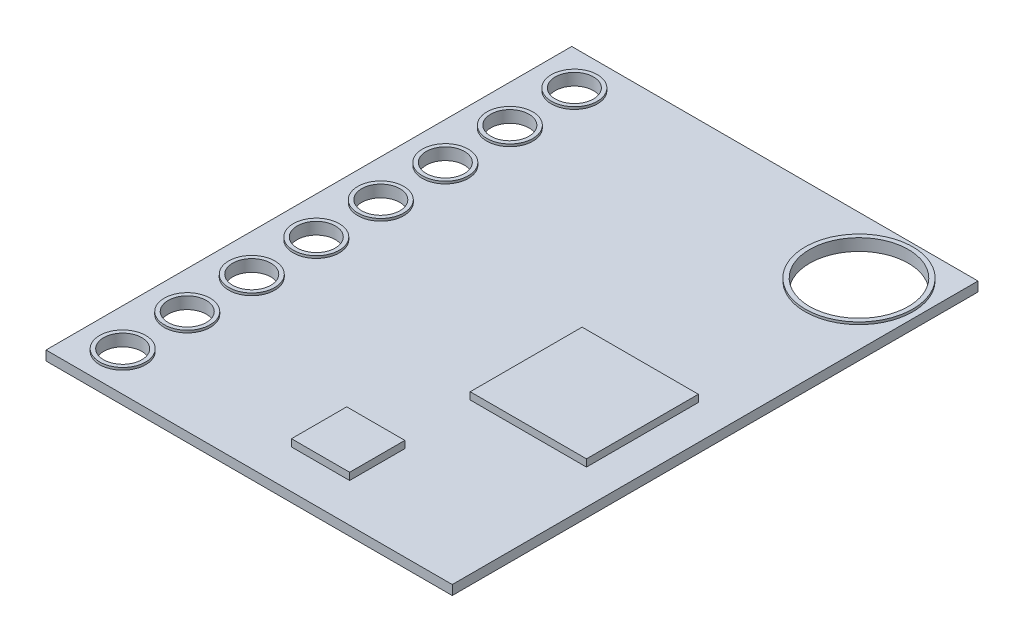
ISO-10303-21;
HEADER;
FILE_DESCRIPTION(('STEP AP214'),'2;1');
FILE_NAME('part.step','',(''),(''),'','','');
FILE_SCHEMA(('AUTOMOTIVE_DESIGN { 1 0 10303 214 1 1 1 1 }'));
ENDSEC;
DATA;
#1=APPLICATION_CONTEXT('core data for automotive mechanical design processes');
#2=APPLICATION_PROTOCOL_DEFINITION('international standard','automotive_design',2000,#1);
#3=PRODUCT_CONTEXT('',#1,'mechanical');
#4=PRODUCT('Part','Part','',(#3));
#5=PRODUCT_RELATED_PRODUCT_CATEGORY('part','',(#4));
#6=PRODUCT_DEFINITION_FORMATION('','',#4);
#7=PRODUCT_DEFINITION_CONTEXT('part definition',#1,'design');
#8=PRODUCT_DEFINITION('design','',#6,#7);
#9=PRODUCT_DEFINITION_SHAPE('','',#8);
#10=(LENGTH_UNIT() NAMED_UNIT(*) SI_UNIT(.MILLI.,.METRE.));
#11=(NAMED_UNIT(*) PLANE_ANGLE_UNIT() SI_UNIT($,.RADIAN.));
#12=(NAMED_UNIT(*) SI_UNIT($,.STERADIAN.) SOLID_ANGLE_UNIT());
#13=UNCERTAINTY_MEASURE_WITH_UNIT(LENGTH_MEASURE(1.E-05),#10,'distance_accuracy_value','');
#14=(GEOMETRIC_REPRESENTATION_CONTEXT(3) GLOBAL_UNCERTAINTY_ASSIGNED_CONTEXT((#13)) GLOBAL_UNIT_ASSIGNED_CONTEXT((#10,
#11,#12)) REPRESENTATION_CONTEXT('',''));
#15=CARTESIAN_POINT('',(0.,0.,0.));
#16=DIRECTION('',(0.,0.,1.));
#17=DIRECTION('',(1.,0.,0.));
#18=AXIS2_PLACEMENT_3D('',#15,#16,#17);
#19=CARTESIAN_POINT('',(0.,0.4,0.));
#20=DIRECTION('',(0.,1.,0.));
#21=DIRECTION('',(0.,0.,1.));
#22=AXIS2_PLACEMENT_3D('',#19,#20,#21);
#23=PLANE('',#22);
#24=CARTESIAN_POINT('',(-8.99836684079585,0.4,8.23355705223881));
#25=DIRECTION('',(0.,1.,0.));
#26=DIRECTION('',(0.,0.,1.));
#27=AXIS2_PLACEMENT_3D('',#24,#25,#26);
#28=CIRCLE('',#27,0.962856640714473);
#29=CARTESIAN_POINT('',(-8.99836684079585,0.4,9.19641369295328));
#30=VERTEX_POINT('',#29);
#31=EDGE_CURVE('E194',#30,#30,#28,.T.);
#32=ORIENTED_EDGE('',*,*,#31,.F.);
#33=EDGE_LOOP('',(#32));
#34=FACE_BOUND('',#33,.T.);
#35=CARTESIAN_POINT('',(-8.9983668407959,0.4,2.83355705223881));
#36=DIRECTION('',(0.,1.,0.));
#37=DIRECTION('',(0.,0.,1.));
#38=AXIS2_PLACEMENT_3D('',#35,#36,#37);
#39=CIRCLE('',#38,0.962856640714473);
#40=CARTESIAN_POINT('',(-8.9983668407959,0.4,3.79641369295328));
#41=VERTEX_POINT('',#40);
#42=EDGE_CURVE('E212',#41,#41,#39,.T.);
#43=ORIENTED_EDGE('',*,*,#42,.F.);
#44=EDGE_LOOP('',(#43));
#45=FACE_BOUND('',#44,.T.);
#46=CARTESIAN_POINT('',(-8.99836684079596,0.4,-2.56644294776119));
#47=DIRECTION('',(0.,1.,0.));
#48=DIRECTION('',(0.,0.,1.));
#49=AXIS2_PLACEMENT_3D('',#46,#47,#48);
#50=CIRCLE('',#49,0.962856640714473);
#51=CARTESIAN_POINT('',(-8.99836684079596,0.4,-1.60358630704672));
#52=VERTEX_POINT('',#51);
#53=EDGE_CURVE('E230',#52,#52,#50,.T.);
#54=ORIENTED_EDGE('',*,*,#53,.F.);
#55=EDGE_LOOP('',(#54));
#56=FACE_BOUND('',#55,.T.);
#57=CARTESIAN_POINT('',(-8.99836684079602,0.4,-7.96644294776119));
#58=DIRECTION('',(0.,1.,0.));
#59=DIRECTION('',(0.,0.,1.));
#60=AXIS2_PLACEMENT_3D('',#57,#58,#59);
#61=CIRCLE('',#60,0.962856640714473);
#62=CARTESIAN_POINT('',(-8.99836684079602,0.4,-7.00358630704672));
#63=VERTEX_POINT('',#62);
#64=EDGE_CURVE('E248',#63,#63,#61,.T.);
#65=ORIENTED_EDGE('',*,*,#64,.F.);
#66=EDGE_LOOP('',(#65));
#67=FACE_BOUND('',#66,.T.);
#68=DIRECTION('',(0.,0.,1.));
#69=VECTOR('',#68,1.);
#70=CARTESIAN_POINT('',(-10.6567164179104,0.4,-9.51492537313432));
#71=LINE('',#70,#69);
#72=CARTESIAN_POINT('',(-10.6567164179104,0.4,-9.51492537313432));
#73=VERTEX_POINT('',#72);
#74=CARTESIAN_POINT('',(-10.6567164179104,0.4,12.4850746268657));
#75=VERTEX_POINT('',#74);
#76=EDGE_CURVE('E291',#73,#75,#71,.T.);
#77=ORIENTED_EDGE('',*,*,#76,.T.);
#78=DIRECTION('',(1.,0.,0.));
#79=VECTOR('',#78,1.);
#80=CARTESIAN_POINT('',(-10.6567164179104,0.4,12.4850746268657));
#81=LINE('',#80,#79);
#82=CARTESIAN_POINT('',(6.34328358208956,0.4,12.4850746268657));
#83=VERTEX_POINT('',#82);
#84=EDGE_CURVE('E294',#75,#83,#81,.T.);
#85=ORIENTED_EDGE('',*,*,#84,.T.);
#86=DIRECTION('',(0.,0.,-1.));
#87=VECTOR('',#86,1.);
#88=CARTESIAN_POINT('',(6.34328358208955,0.4,-9.51492537313432));
#89=LINE('',#88,#87);
#90=CARTESIAN_POINT('',(6.34328358208955,0.4,-9.51492537313432));
#91=VERTEX_POINT('',#90);
#92=EDGE_CURVE('E297',#83,#91,#89,.T.);
#93=ORIENTED_EDGE('',*,*,#92,.T.);
#94=DIRECTION('',(-1.,0.,0.));
#95=VECTOR('',#94,1.);
#96=CARTESIAN_POINT('',(-10.6567164179104,0.4,-9.51492537313432));
#97=LINE('',#96,#95);
#98=EDGE_CURVE('E299',#91,#73,#97,.T.);
#99=ORIENTED_EDGE('',*,*,#98,.T.);
#100=EDGE_LOOP('',(#77,#85,#93,#99));
#101=FACE_BOUND('',#100,.T.);
#102=CARTESIAN_POINT('',(3.84328358208955,0.4,-7.03420016169154));
#103=DIRECTION('',(0.,1.,0.));
#104=DIRECTION('',(0.,0.,1.));
#105=AXIS2_PLACEMENT_3D('',#102,#103,#104);
#106=CIRCLE('',#105,2.25361578234417);
#107=CARTESIAN_POINT('',(3.84328358208955,0.4,-4.78058437934737));
#108=VERTEX_POINT('',#107);
#109=EDGE_CURVE('E257',#108,#108,#106,.T.);
#110=ORIENTED_EDGE('',*,*,#109,.F.);
#111=EDGE_LOOP('',(#110));
#112=FACE_BOUND('',#111,.T.);
#113=CARTESIAN_POINT('',(-8.99836684079599,0.4,-5.26644294776119));
#114=DIRECTION('',(0.,1.,0.));
#115=DIRECTION('',(0.,0.,1.));
#116=AXIS2_PLACEMENT_3D('',#113,#114,#115);
#117=CIRCLE('',#116,0.962856640714473);
#118=CARTESIAN_POINT('',(-8.99836684079599,0.4,-4.30358630704672));
#119=VERTEX_POINT('',#118);
#120=EDGE_CURVE('E239',#119,#119,#117,.T.);
#121=ORIENTED_EDGE('',*,*,#120,.F.);
#122=EDGE_LOOP('',(#121));
#123=FACE_BOUND('',#122,.T.);
#124=CARTESIAN_POINT('',(-8.99836684079593,0.4,0.13355705223881));
#125=DIRECTION('',(0.,1.,0.));
#126=DIRECTION('',(0.,0.,1.));
#127=AXIS2_PLACEMENT_3D('',#124,#125,#126);
#128=CIRCLE('',#127,0.962856640714473);
#129=CARTESIAN_POINT('',(-8.99836684079593,0.4,1.09641369295328));
#130=VERTEX_POINT('',#129);
#131=EDGE_CURVE('E221',#130,#130,#128,.T.);
#132=ORIENTED_EDGE('',*,*,#131,.F.);
#133=EDGE_LOOP('',(#132));
#134=FACE_BOUND('',#133,.T.);
#135=CARTESIAN_POINT('',(-8.99836684079587,0.4,5.53355705223881));
#136=DIRECTION('',(0.,1.,0.));
#137=DIRECTION('',(0.,0.,1.));
#138=AXIS2_PLACEMENT_3D('',#135,#136,#137);
#139=CIRCLE('',#138,0.962856640714473);
#140=CARTESIAN_POINT('',(-8.99836684079587,0.4,6.49641369295328));
#141=VERTEX_POINT('',#140);
#142=EDGE_CURVE('E203',#141,#141,#139,.T.);
#143=ORIENTED_EDGE('',*,*,#142,.F.);
#144=EDGE_LOOP('',(#143));
#145=FACE_BOUND('',#144,.T.);
#146=CARTESIAN_POINT('',(-8.99836684079582,0.4,10.9335570522388));
#147=DIRECTION('',(0.,1.,0.));
#148=DIRECTION('',(0.,0.,1.));
#149=AXIS2_PLACEMENT_3D('',#146,#147,#148);
#150=CIRCLE('',#149,0.962856640714473);
#151=CARTESIAN_POINT('',(-8.99836684079582,0.4,11.8964136929533));
#152=VERTEX_POINT('',#151);
#153=EDGE_CURVE('E185',#152,#152,#150,.T.);
#154=ORIENTED_EDGE('',*,*,#153,.F.);
#155=EDGE_LOOP('',(#154));
#156=FACE_BOUND('',#155,.T.);
#157=DIRECTION('',(-1.,0.,0.));
#158=VECTOR('',#157,1.);
#159=CARTESIAN_POINT('',(-2.00471202187422,0.4,8.5532790425502));
#160=LINE('',#159,#158);
#161=CARTESIAN_POINT('',(0.427358314705403,0.4,8.5532790425502));
#162=VERTEX_POINT('',#161);
#163=CARTESIAN_POINT('',(-2.00471202187422,0.4,8.5532790425502));
#164=VERTEX_POINT('',#163);
#165=EDGE_CURVE('E154',#162,#164,#160,.T.);
#166=ORIENTED_EDGE('',*,*,#165,.F.);
#167=DIRECTION('',(0.,0.,-1.));
#168=VECTOR('',#167,1.);
#169=CARTESIAN_POINT('',(0.427358314705403,0.4,10.8637458623008));
#170=LINE('',#169,#168);
#171=CARTESIAN_POINT('',(0.427358314705403,0.4,10.8637458623008));
#172=VERTEX_POINT('',#171);
#173=EDGE_CURVE('E151',#172,#162,#170,.T.);
#174=ORIENTED_EDGE('',*,*,#173,.F.);
#175=DIRECTION('',(1.,0.,0.));
#176=VECTOR('',#175,1.);
#177=CARTESIAN_POINT('',(-2.00471202187422,0.4,10.8637458623008));
#178=LINE('',#177,#176);
#179=CARTESIAN_POINT('',(-2.00471202187422,0.4,10.8637458623008));
#180=VERTEX_POINT('',#179);
#181=EDGE_CURVE('E163',#180,#172,#178,.T.);
#182=ORIENTED_EDGE('',*,*,#181,.F.);
#183=DIRECTION('',(0.,0.,1.));
#184=VECTOR('',#183,1.);
#185=CARTESIAN_POINT('',(-2.00471202187422,0.4,10.8637458623008));
#186=LINE('',#185,#184);
#187=EDGE_CURVE('E171',#164,#180,#186,.T.);
#188=ORIENTED_EDGE('',*,*,#187,.F.);
#189=EDGE_LOOP('',(#166,#174,#182,#188));
#190=FACE_BOUND('',#189,.T.);
#191=DIRECTION('',(-1.,0.,0.));
#192=VECTOR('',#191,1.);
#193=CARTESIAN_POINT('',(0.0321468850112208,0.4,0.740253086288166));
#194=LINE('',#193,#192);
#195=CARTESIAN_POINT('',(4.89628755817046,0.4,0.740253086288166));
#196=VERTEX_POINT('',#195);
#197=CARTESIAN_POINT('',(0.0321468850112208,0.4,0.740253086288166));
#198=VERTEX_POINT('',#197);
#199=EDGE_CURVE('E683',#196,#198,#194,.T.);
#200=ORIENTED_EDGE('',*,*,#199,.F.);
#201=DIRECTION('',(0.,0.,-1.));
#202=VECTOR('',#201,1.);
#203=CARTESIAN_POINT('',(4.89628755817046,0.4,5.42198848420393));
#204=LINE('',#203,#202);
#205=CARTESIAN_POINT('',(4.89628755817046,0.4,5.42198848420393));
#206=VERTEX_POINT('',#205);
#207=EDGE_CURVE('E149',#206,#196,#204,.T.);
#208=ORIENTED_EDGE('',*,*,#207,.F.);
#209=DIRECTION('',(1.,0.,0.));
#210=VECTOR('',#209,1.);
#211=CARTESIAN_POINT('',(0.0321468850112208,0.4,5.42198848420393));
#212=LINE('',#211,#210);
#213=CARTESIAN_POINT('',(0.0321468850112208,0.4,5.42198848420393));
#214=VERTEX_POINT('',#213);
#215=EDGE_CURVE('E145',#214,#206,#212,.T.);
#216=ORIENTED_EDGE('',*,*,#215,.F.);
#217=DIRECTION('',(0.,0.,1.));
#218=VECTOR('',#217,1.);
#219=CARTESIAN_POINT('',(0.0321468850112208,0.4,5.42198848420393));
#220=LINE('',#219,#218);
#221=EDGE_CURVE('E680',#198,#214,#220,.T.);
#222=ORIENTED_EDGE('',*,*,#221,.F.);
#223=EDGE_LOOP('',(#200,#208,#216,#222));
#224=FACE_BOUND('',#223,.T.);
#225=ADVANCED_FACE('F36',(#34,#45,#56,#67,#101,#112,#123,#134,#145,#156,#190,#224),#23,.T.);
#226=CARTESIAN_POINT('',(0.,0.,0.));
#227=DIRECTION('',(0.,1.,0.));
#228=DIRECTION('',(0.,0.,1.));
#229=AXIS2_PLACEMENT_3D('',#226,#227,#228);
#230=PLANE('',#229);
#231=DIRECTION('',(0.,0.,1.));
#232=VECTOR('',#231,1.);
#233=CARTESIAN_POINT('',(-10.6567164179104,0.,-9.51492537313432));
#234=LINE('',#233,#232);
#235=CARTESIAN_POINT('',(-10.6567164179104,0.,-9.51492537313432));
#236=VERTEX_POINT('',#235);
#237=CARTESIAN_POINT('',(-10.6567164179104,0.,12.4850746268657));
#238=VERTEX_POINT('',#237);
#239=EDGE_CURVE('E290',#236,#238,#234,.T.);
#240=ORIENTED_EDGE('',*,*,#239,.F.);
#241=DIRECTION('',(-1.,0.,0.));
#242=VECTOR('',#241,1.);
#243=CARTESIAN_POINT('',(-10.6567164179104,0.,-9.51492537313432));
#244=LINE('',#243,#242);
#245=CARTESIAN_POINT('',(6.34328358208955,0.,-9.51492537313432));
#246=VERTEX_POINT('',#245);
#247=EDGE_CURVE('E295',#246,#236,#244,.T.);
#248=ORIENTED_EDGE('',*,*,#247,.F.);
#249=DIRECTION('',(0.,0.,-1.));
#250=VECTOR('',#249,1.);
#251=CARTESIAN_POINT('',(6.34328358208955,0.,-9.51492537313432));
#252=LINE('',#251,#250);
#253=CARTESIAN_POINT('',(6.34328358208956,0.,12.4850746268657));
#254=VERTEX_POINT('',#253);
#255=EDGE_CURVE('E306',#254,#246,#252,.T.);
#256=ORIENTED_EDGE('',*,*,#255,.F.);
#257=DIRECTION('',(1.,0.,0.));
#258=VECTOR('',#257,1.);
#259=CARTESIAN_POINT('',(-10.6567164179104,0.,12.4850746268657));
#260=LINE('',#259,#258);
#261=EDGE_CURVE('E304',#238,#254,#260,.T.);
#262=ORIENTED_EDGE('',*,*,#261,.F.);
#263=EDGE_LOOP('',(#240,#248,#256,#262));
#264=FACE_BOUND('',#263,.T.);
#265=CARTESIAN_POINT('',(3.84328358208955,0.,-7.03420016169154));
#266=DIRECTION('',(0.,1.,0.));
#267=DIRECTION('',(0.,0.,1.));
#268=AXIS2_PLACEMENT_3D('',#265,#266,#267);
#269=CIRCLE('',#268,2.06656642514472);
#270=CARTESIAN_POINT('',(3.84328358208955,0.,-4.96763373654682));
#271=VERTEX_POINT('',#270);
#272=EDGE_CURVE('E287',#271,#271,#269,.T.);
#273=ORIENTED_EDGE('',*,*,#272,.T.);
#274=EDGE_LOOP('',(#273));
#275=FACE_BOUND('',#274,.T.);
#276=CARTESIAN_POINT('',(-8.99836684079602,0.,-7.96644294776119));
#277=DIRECTION('',(0.,1.,0.));
#278=DIRECTION('',(0.,0.,1.));
#279=AXIS2_PLACEMENT_3D('',#276,#277,#278);
#280=CIRCLE('',#279,0.800000000000001);
#281=CARTESIAN_POINT('',(-8.99836684079602,0.,-7.16644294776119));
#282=VERTEX_POINT('',#281);
#283=EDGE_CURVE('E284',#282,#282,#280,.T.);
#284=ORIENTED_EDGE('',*,*,#283,.T.);
#285=EDGE_LOOP('',(#284));
#286=FACE_BOUND('',#285,.T.);
#287=CARTESIAN_POINT('',(-8.99836684079599,0.,-5.26644294776119));
#288=DIRECTION('',(0.,1.,0.));
#289=DIRECTION('',(0.,0.,1.));
#290=AXIS2_PLACEMENT_3D('',#287,#288,#289);
#291=CIRCLE('',#290,0.800000000000001);
#292=CARTESIAN_POINT('',(-8.99836684079599,0.,-4.46644294776119));
#293=VERTEX_POINT('',#292);
#294=EDGE_CURVE('E281',#293,#293,#291,.T.);
#295=ORIENTED_EDGE('',*,*,#294,.T.);
#296=EDGE_LOOP('',(#295));
#297=FACE_BOUND('',#296,.T.);
#298=CARTESIAN_POINT('',(-8.99836684079596,0.,-2.56644294776119));
#299=DIRECTION('',(0.,1.,0.));
#300=DIRECTION('',(0.,0.,1.));
#301=AXIS2_PLACEMENT_3D('',#298,#299,#300);
#302=CIRCLE('',#301,0.800000000000001);
#303=CARTESIAN_POINT('',(-8.99836684079596,0.,-1.76644294776119));
#304=VERTEX_POINT('',#303);
#305=EDGE_CURVE('E278',#304,#304,#302,.T.);
#306=ORIENTED_EDGE('',*,*,#305,.T.);
#307=EDGE_LOOP('',(#306));
#308=FACE_BOUND('',#307,.T.);
#309=CARTESIAN_POINT('',(-8.99836684079593,0.,0.13355705223881));
#310=DIRECTION('',(0.,1.,0.));
#311=DIRECTION('',(0.,0.,1.));
#312=AXIS2_PLACEMENT_3D('',#309,#310,#311);
#313=CIRCLE('',#312,0.800000000000001);
#314=CARTESIAN_POINT('',(-8.99836684079593,0.,0.933557052238811));
#315=VERTEX_POINT('',#314);
#316=EDGE_CURVE('E275',#315,#315,#313,.T.);
#317=ORIENTED_EDGE('',*,*,#316,.T.);
#318=EDGE_LOOP('',(#317));
#319=FACE_BOUND('',#318,.T.);
#320=CARTESIAN_POINT('',(-8.9983668407959,0.,2.83355705223881));
#321=DIRECTION('',(0.,1.,0.));
#322=DIRECTION('',(0.,0.,1.));
#323=AXIS2_PLACEMENT_3D('',#320,#321,#322);
#324=CIRCLE('',#323,0.800000000000001);
#325=CARTESIAN_POINT('',(-8.9983668407959,0.,3.63355705223881));
#326=VERTEX_POINT('',#325);
#327=EDGE_CURVE('E272',#326,#326,#324,.T.);
#328=ORIENTED_EDGE('',*,*,#327,.T.);
#329=EDGE_LOOP('',(#328));
#330=FACE_BOUND('',#329,.T.);
#331=CARTESIAN_POINT('',(-8.99836684079587,0.,5.53355705223881));
#332=DIRECTION('',(0.,1.,0.));
#333=DIRECTION('',(0.,0.,1.));
#334=AXIS2_PLACEMENT_3D('',#331,#332,#333);
#335=CIRCLE('',#334,0.800000000000001);
#336=CARTESIAN_POINT('',(-8.99836684079587,0.,6.33355705223881));
#337=VERTEX_POINT('',#336);
#338=EDGE_CURVE('E269',#337,#337,#335,.T.);
#339=ORIENTED_EDGE('',*,*,#338,.T.);
#340=EDGE_LOOP('',(#339));
#341=FACE_BOUND('',#340,.T.);
#342=CARTESIAN_POINT('',(-8.99836684079585,0.,8.23355705223881));
#343=DIRECTION('',(0.,1.,0.));
#344=DIRECTION('',(0.,0.,1.));
#345=AXIS2_PLACEMENT_3D('',#342,#343,#344);
#346=CIRCLE('',#345,0.800000000000001);
#347=CARTESIAN_POINT('',(-8.99836684079585,0.,9.03355705223881));
#348=VERTEX_POINT('',#347);
#349=EDGE_CURVE('E266',#348,#348,#346,.T.);
#350=ORIENTED_EDGE('',*,*,#349,.T.);
#351=EDGE_LOOP('',(#350));
#352=FACE_BOUND('',#351,.T.);
#353=CARTESIAN_POINT('',(-8.99836684079582,0.,10.9335570522388));
#354=DIRECTION('',(0.,1.,0.));
#355=DIRECTION('',(0.,0.,1.));
#356=AXIS2_PLACEMENT_3D('',#353,#354,#355);
#357=CIRCLE('',#356,0.800000000000001);
#358=CARTESIAN_POINT('',(-8.99836684079582,0.,11.7335570522388));
#359=VERTEX_POINT('',#358);
#360=EDGE_CURVE('E261',#359,#359,#357,.T.);
#361=ORIENTED_EDGE('',*,*,#360,.T.);
#362=EDGE_LOOP('',(#361));
#363=FACE_BOUND('',#362,.T.);
#364=ADVANCED_FACE('F324',(#264,#275,#286,#297,#308,#319,#330,#341,#352,#363),#230,.F.);
#365=CARTESIAN_POINT('',(-10.6567164179104,0.4,-9.51492537313432));
#366=DIRECTION('',(1.,0.,0.));
#367=DIRECTION('',(0.,0.,-1.));
#368=AXIS2_PLACEMENT_3D('',#365,#366,#367);
#369=PLANE('',#368);
#370=ORIENTED_EDGE('',*,*,#239,.T.);
#371=DIRECTION('',(0.,-1.,0.));
#372=VECTOR('',#371,1.);
#373=CARTESIAN_POINT('',(-10.6567164179104,0.4,12.4850746268657));
#374=LINE('',#373,#372);
#375=EDGE_CURVE('E11',#75,#238,#374,.T.);
#376=ORIENTED_EDGE('',*,*,#375,.F.);
#377=ORIENTED_EDGE('',*,*,#76,.F.);
#378=DIRECTION('',(0.,-1.,0.));
#379=VECTOR('',#378,1.);
#380=CARTESIAN_POINT('',(-10.6567164179104,0.4,-9.51492537313432));
#381=LINE('',#380,#379);
#382=EDGE_CURVE('E301',#73,#236,#381,.T.);
#383=ORIENTED_EDGE('',*,*,#382,.T.);
#384=EDGE_LOOP('',(#370,#376,#377,#383));
#385=FACE_BOUND('',#384,.T.);
#386=ADVANCED_FACE('F38',(#385),#369,.F.);
#387=CARTESIAN_POINT('',(-10.6567164179104,0.4,12.4850746268657));
#388=DIRECTION('',(0.,0.,-1.));
#389=DIRECTION('',(-1.,0.,0.));
#390=AXIS2_PLACEMENT_3D('',#387,#388,#389);
#391=PLANE('',#390);
#392=ORIENTED_EDGE('',*,*,#261,.T.);
#393=DIRECTION('',(0.,-1.,0.));
#394=VECTOR('',#393,1.);
#395=CARTESIAN_POINT('',(6.34328358208956,0.4,12.4850746268657));
#396=LINE('',#395,#394);
#397=EDGE_CURVE('E44',#83,#254,#396,.T.);
#398=ORIENTED_EDGE('',*,*,#397,.F.);
#399=ORIENTED_EDGE('',*,*,#84,.F.);
#400=ORIENTED_EDGE('',*,*,#375,.T.);
#401=EDGE_LOOP('',(#392,#398,#399,#400));
#402=FACE_BOUND('',#401,.T.);
#403=ADVANCED_FACE('F335',(#402),#391,.F.);
#404=CARTESIAN_POINT('',(6.34328358208955,0.4,-9.51492537313432));
#405=DIRECTION('',(-1.,0.,0.));
#406=DIRECTION('',(0.,0.,1.));
#407=AXIS2_PLACEMENT_3D('',#404,#405,#406);
#408=PLANE('',#407);
#409=ORIENTED_EDGE('',*,*,#255,.T.);
#410=DIRECTION('',(0.,-1.,0.));
#411=VECTOR('',#410,1.);
#412=CARTESIAN_POINT('',(6.34328358208955,0.4,-9.51492537313432));
#413=LINE('',#412,#411);
#414=EDGE_CURVE('E311',#91,#246,#413,.T.);
#415=ORIENTED_EDGE('',*,*,#414,.F.);
#416=ORIENTED_EDGE('',*,*,#92,.F.);
#417=ORIENTED_EDGE('',*,*,#397,.T.);
#418=EDGE_LOOP('',(#409,#415,#416,#417));
#419=FACE_BOUND('',#418,.T.);
#420=ADVANCED_FACE('F318',(#419),#408,.F.);
#421=CARTESIAN_POINT('',(-10.6567164179104,0.4,-9.51492537313432));
#422=DIRECTION('',(0.,0.,1.));
#423=DIRECTION('',(1.,0.,0.));
#424=AXIS2_PLACEMENT_3D('',#421,#422,#423);
#425=PLANE('',#424);
#426=ORIENTED_EDGE('',*,*,#247,.T.);
#427=ORIENTED_EDGE('',*,*,#382,.F.);
#428=ORIENTED_EDGE('',*,*,#98,.F.);
#429=ORIENTED_EDGE('',*,*,#414,.T.);
#430=EDGE_LOOP('',(#426,#427,#428,#429));
#431=FACE_BOUND('',#430,.T.);
#432=ADVANCED_FACE('F328',(#431),#425,.F.);
#433=CARTESIAN_POINT('',(3.84328358208955,0.4,-7.03420016169154));
#434=DIRECTION('',(0.,-1.,0.));
#435=DIRECTION('',(0.,0.,-1.));
#436=AXIS2_PLACEMENT_3D('',#433,#434,#435);
#437=CYLINDRICAL_SURFACE('',#436,2.06656642514472);
#438=ORIENTED_EDGE('',*,*,#272,.F.);
#439=EDGE_LOOP('',(#438));
#440=FACE_BOUND('',#439,.T.);
#441=CARTESIAN_POINT('',(3.84328358208955,0.5,-7.03420016169154));
#442=DIRECTION('',(0.,1.,0.));
#443=DIRECTION('',(0.,0.,1.));
#444=AXIS2_PLACEMENT_3D('',#441,#442,#443);
#445=CIRCLE('',#444,2.06656642514472);
#446=CARTESIAN_POINT('',(3.84328358208955,0.5,-4.96763373654682));
#447=VERTEX_POINT('',#446);
#448=EDGE_CURVE('E252',#447,#447,#445,.T.);
#449=ORIENTED_EDGE('',*,*,#448,.T.);
#450=EDGE_LOOP('',(#449));
#451=FACE_BOUND('',#450,.T.);
#452=ADVANCED_FACE('F352',(#440,#451),#437,.F.);
#453=CARTESIAN_POINT('',(-8.99836684079602,0.4,-7.96644294776119));
#454=DIRECTION('',(0.,-1.,0.));
#455=DIRECTION('',(0.,0.,-1.));
#456=AXIS2_PLACEMENT_3D('',#453,#454,#455);
#457=CYLINDRICAL_SURFACE('',#456,0.800000000000001);
#458=ORIENTED_EDGE('',*,*,#283,.F.);
#459=EDGE_LOOP('',(#458));
#460=FACE_BOUND('',#459,.T.);
#461=CARTESIAN_POINT('',(-8.99836684079602,0.5,-7.96644294776119));
#462=DIRECTION('',(0.,1.,0.));
#463=DIRECTION('',(0.,0.,1.));
#464=AXIS2_PLACEMENT_3D('',#461,#462,#463);
#465=CIRCLE('',#464,0.800000000000001);
#466=CARTESIAN_POINT('',(-8.99836684079602,0.5,-7.16644294776119));
#467=VERTEX_POINT('',#466);
#468=EDGE_CURVE('E243',#467,#467,#465,.T.);
#469=ORIENTED_EDGE('',*,*,#468,.T.);
#470=EDGE_LOOP('',(#469));
#471=FACE_BOUND('',#470,.T.);
#472=ADVANCED_FACE('F359',(#460,#471),#457,.F.);
#473=CARTESIAN_POINT('',(-8.99836684079599,0.4,-5.26644294776119));
#474=DIRECTION('',(0.,-1.,0.));
#475=DIRECTION('',(0.,0.,-1.));
#476=AXIS2_PLACEMENT_3D('',#473,#474,#475);
#477=CYLINDRICAL_SURFACE('',#476,0.800000000000001);
#478=ORIENTED_EDGE('',*,*,#294,.F.);
#479=EDGE_LOOP('',(#478));
#480=FACE_BOUND('',#479,.T.);
#481=CARTESIAN_POINT('',(-8.99836684079599,0.5,-5.26644294776119));
#482=DIRECTION('',(0.,1.,0.));
#483=DIRECTION('',(0.,0.,1.));
#484=AXIS2_PLACEMENT_3D('',#481,#482,#483);
#485=CIRCLE('',#484,0.800000000000001);
#486=CARTESIAN_POINT('',(-8.99836684079599,0.5,-4.46644294776119));
#487=VERTEX_POINT('',#486);
#488=EDGE_CURVE('E234',#487,#487,#485,.T.);
#489=ORIENTED_EDGE('',*,*,#488,.T.);
#490=EDGE_LOOP('',(#489));
#491=FACE_BOUND('',#490,.T.);
#492=ADVANCED_FACE('F364',(#480,#491),#477,.F.);
#493=CARTESIAN_POINT('',(-8.99836684079596,0.4,-2.56644294776119));
#494=DIRECTION('',(0.,-1.,0.));
#495=DIRECTION('',(0.,0.,-1.));
#496=AXIS2_PLACEMENT_3D('',#493,#494,#495);
#497=CYLINDRICAL_SURFACE('',#496,0.800000000000001);
#498=ORIENTED_EDGE('',*,*,#305,.F.);
#499=EDGE_LOOP('',(#498));
#500=FACE_BOUND('',#499,.T.);
#501=CARTESIAN_POINT('',(-8.99836684079596,0.5,-2.56644294776119));
#502=DIRECTION('',(0.,1.,0.));
#503=DIRECTION('',(0.,0.,1.));
#504=AXIS2_PLACEMENT_3D('',#501,#502,#503);
#505=CIRCLE('',#504,0.800000000000001);
#506=CARTESIAN_POINT('',(-8.99836684079596,0.5,-1.76644294776119));
#507=VERTEX_POINT('',#506);
#508=EDGE_CURVE('E225',#507,#507,#505,.T.);
#509=ORIENTED_EDGE('',*,*,#508,.T.);
#510=EDGE_LOOP('',(#509));
#511=FACE_BOUND('',#510,.T.);
#512=ADVANCED_FACE('F404',(#500,#511),#497,.F.);
#513=CARTESIAN_POINT('',(-8.99836684079593,0.4,0.13355705223881));
#514=DIRECTION('',(0.,-1.,0.));
#515=DIRECTION('',(0.,0.,-1.));
#516=AXIS2_PLACEMENT_3D('',#513,#514,#515);
#517=CYLINDRICAL_SURFACE('',#516,0.800000000000001);
#518=ORIENTED_EDGE('',*,*,#316,.F.);
#519=EDGE_LOOP('',(#518));
#520=FACE_BOUND('',#519,.T.);
#521=CARTESIAN_POINT('',(-8.99836684079593,0.5,0.13355705223881));
#522=DIRECTION('',(0.,1.,0.));
#523=DIRECTION('',(0.,0.,1.));
#524=AXIS2_PLACEMENT_3D('',#521,#522,#523);
#525=CIRCLE('',#524,0.800000000000001);
#526=CARTESIAN_POINT('',(-8.99836684079593,0.5,0.933557052238811));
#527=VERTEX_POINT('',#526);
#528=EDGE_CURVE('E216',#527,#527,#525,.T.);
#529=ORIENTED_EDGE('',*,*,#528,.T.);
#530=EDGE_LOOP('',(#529));
#531=FACE_BOUND('',#530,.T.);
#532=ADVANCED_FACE('F400',(#520,#531),#517,.F.);
#533=CARTESIAN_POINT('',(-8.9983668407959,0.4,2.83355705223881));
#534=DIRECTION('',(0.,-1.,0.));
#535=DIRECTION('',(0.,0.,-1.));
#536=AXIS2_PLACEMENT_3D('',#533,#534,#535);
#537=CYLINDRICAL_SURFACE('',#536,0.800000000000001);
#538=ORIENTED_EDGE('',*,*,#327,.F.);
#539=EDGE_LOOP('',(#538));
#540=FACE_BOUND('',#539,.T.);
#541=CARTESIAN_POINT('',(-8.9983668407959,0.5,2.83355705223881));
#542=DIRECTION('',(0.,1.,0.));
#543=DIRECTION('',(0.,0.,1.));
#544=AXIS2_PLACEMENT_3D('',#541,#542,#543);
#545=CIRCLE('',#544,0.800000000000001);
#546=CARTESIAN_POINT('',(-8.9983668407959,0.5,3.63355705223881));
#547=VERTEX_POINT('',#546);
#548=EDGE_CURVE('E207',#547,#547,#545,.T.);
#549=ORIENTED_EDGE('',*,*,#548,.T.);
#550=EDGE_LOOP('',(#549));
#551=FACE_BOUND('',#550,.T.);
#552=ADVANCED_FACE('F396',(#540,#551),#537,.F.);
#553=CARTESIAN_POINT('',(-8.99836684079587,0.4,5.53355705223881));
#554=DIRECTION('',(0.,-1.,0.));
#555=DIRECTION('',(0.,0.,-1.));
#556=AXIS2_PLACEMENT_3D('',#553,#554,#555);
#557=CYLINDRICAL_SURFACE('',#556,0.800000000000001);
#558=ORIENTED_EDGE('',*,*,#338,.F.);
#559=EDGE_LOOP('',(#558));
#560=FACE_BOUND('',#559,.T.);
#561=CARTESIAN_POINT('',(-8.99836684079587,0.5,5.53355705223881));
#562=DIRECTION('',(0.,1.,0.));
#563=DIRECTION('',(0.,0.,1.));
#564=AXIS2_PLACEMENT_3D('',#561,#562,#563);
#565=CIRCLE('',#564,0.800000000000001);
#566=CARTESIAN_POINT('',(-8.99836684079587,0.5,6.33355705223881));
#567=VERTEX_POINT('',#566);
#568=EDGE_CURVE('E198',#567,#567,#565,.T.);
#569=ORIENTED_EDGE('',*,*,#568,.T.);
#570=EDGE_LOOP('',(#569));
#571=FACE_BOUND('',#570,.T.);
#572=ADVANCED_FACE('F392',(#560,#571),#557,.F.);
#573=CARTESIAN_POINT('',(-8.99836684079585,0.4,8.23355705223881));
#574=DIRECTION('',(0.,-1.,0.));
#575=DIRECTION('',(0.,0.,-1.));
#576=AXIS2_PLACEMENT_3D('',#573,#574,#575);
#577=CYLINDRICAL_SURFACE('',#576,0.800000000000001);
#578=ORIENTED_EDGE('',*,*,#349,.F.);
#579=EDGE_LOOP('',(#578));
#580=FACE_BOUND('',#579,.T.);
#581=CARTESIAN_POINT('',(-8.99836684079585,0.5,8.23355705223881));
#582=DIRECTION('',(0.,1.,0.));
#583=DIRECTION('',(0.,0.,1.));
#584=AXIS2_PLACEMENT_3D('',#581,#582,#583);
#585=CIRCLE('',#584,0.800000000000001);
#586=CARTESIAN_POINT('',(-8.99836684079585,0.5,9.03355705223881));
#587=VERTEX_POINT('',#586);
#588=EDGE_CURVE('E189',#587,#587,#585,.T.);
#589=ORIENTED_EDGE('',*,*,#588,.T.);
#590=EDGE_LOOP('',(#589));
#591=FACE_BOUND('',#590,.T.);
#592=ADVANCED_FACE('F383',(#580,#591),#577,.F.);
#593=CARTESIAN_POINT('',(-8.99836684079582,0.4,10.9335570522388));
#594=DIRECTION('',(0.,-1.,0.));
#595=DIRECTION('',(0.,0.,-1.));
#596=AXIS2_PLACEMENT_3D('',#593,#594,#595);
#597=CYLINDRICAL_SURFACE('',#596,0.800000000000001);
#598=ORIENTED_EDGE('',*,*,#360,.F.);
#599=EDGE_LOOP('',(#598));
#600=FACE_BOUND('',#599,.T.);
#601=CARTESIAN_POINT('',(-8.99836684079582,0.5,10.9335570522388));
#602=DIRECTION('',(0.,1.,0.));
#603=DIRECTION('',(0.,0.,1.));
#604=AXIS2_PLACEMENT_3D('',#601,#602,#603);
#605=CIRCLE('',#604,0.800000000000001);
#606=CARTESIAN_POINT('',(-8.99836684079582,0.5,11.7335570522388));
#607=VERTEX_POINT('',#606);
#608=EDGE_CURVE('E182',#607,#607,#605,.T.);
#609=ORIENTED_EDGE('',*,*,#608,.T.);
#610=EDGE_LOOP('',(#609));
#611=FACE_BOUND('',#610,.T.);
#612=ADVANCED_FACE('F373',(#600,#611),#597,.F.);
#613=CARTESIAN_POINT('',(3.84328358208955,0.5,-7.03420016169154));
#614=DIRECTION('',(0.,1.,0.));
#615=DIRECTION('',(0.,0.,1.));
#616=AXIS2_PLACEMENT_3D('',#613,#614,#615);
#617=PLANE('',#616);
#618=CARTESIAN_POINT('',(3.84328358208955,0.5,-7.03420016169154));
#619=DIRECTION('',(0.,1.,0.));
#620=DIRECTION('',(0.,0.,1.));
#621=AXIS2_PLACEMENT_3D('',#618,#619,#620);
#622=CIRCLE('',#621,2.25361578234417);
#623=CARTESIAN_POINT('',(3.84328358208955,0.5,-4.78058437934737));
#624=VERTEX_POINT('',#623);
#625=EDGE_CURVE('E258',#624,#624,#622,.T.);
#626=ORIENTED_EDGE('',*,*,#625,.T.);
#627=EDGE_LOOP('',(#626));
#628=FACE_BOUND('',#627,.T.);
#629=ORIENTED_EDGE('',*,*,#448,.F.);
#630=EDGE_LOOP('',(#629));
#631=FACE_BOUND('',#630,.T.);
#632=ADVANCED_FACE('F370',(#628,#631),#617,.T.);
#633=CARTESIAN_POINT('',(3.84328358208955,0.5,-7.03420016169154));
#634=DIRECTION('',(0.,-1.,0.));
#635=DIRECTION('',(0.,0.,-1.));
#636=AXIS2_PLACEMENT_3D('',#633,#634,#635);
#637=CYLINDRICAL_SURFACE('',#636,2.25361578234417);
#638=ORIENTED_EDGE('',*,*,#625,.F.);
#639=EDGE_LOOP('',(#638));
#640=FACE_BOUND('',#639,.T.);
#641=ORIENTED_EDGE('',*,*,#109,.T.);
#642=EDGE_LOOP('',(#641));
#643=FACE_BOUND('',#642,.T.);
#644=ADVANCED_FACE('F372',(#640,#643),#637,.T.);
#645=CARTESIAN_POINT('',(-8.99836684079602,0.5,-7.96644294776119));
#646=DIRECTION('',(0.,1.,0.));
#647=DIRECTION('',(0.,0.,1.));
#648=AXIS2_PLACEMENT_3D('',#645,#646,#647);
#649=PLANE('',#648);
#650=CARTESIAN_POINT('',(-8.99836684079602,0.5,-7.96644294776119));
#651=DIRECTION('',(0.,1.,0.));
#652=DIRECTION('',(0.,0.,1.));
#653=AXIS2_PLACEMENT_3D('',#650,#651,#652);
#654=CIRCLE('',#653,0.962856640714473);
#655=CARTESIAN_POINT('',(-8.99836684079602,0.5,-7.00358630704672));
#656=VERTEX_POINT('',#655);
#657=EDGE_CURVE('E249',#656,#656,#654,.T.);
#658=ORIENTED_EDGE('',*,*,#657,.T.);
#659=EDGE_LOOP('',(#658));
#660=FACE_BOUND('',#659,.T.);
#661=ORIENTED_EDGE('',*,*,#468,.F.);
#662=EDGE_LOOP('',(#661));
#663=FACE_BOUND('',#662,.T.);
#664=ADVANCED_FACE('F380',(#660,#663),#649,.T.);
#665=CARTESIAN_POINT('',(-8.99836684079602,0.5,-7.96644294776119));
#666=DIRECTION('',(0.,-1.,0.));
#667=DIRECTION('',(0.,0.,-1.));
#668=AXIS2_PLACEMENT_3D('',#665,#666,#667);
#669=CYLINDRICAL_SURFACE('',#668,0.962856640714473);
#670=ORIENTED_EDGE('',*,*,#657,.F.);
#671=EDGE_LOOP('',(#670));
#672=FACE_BOUND('',#671,.T.);
#673=ORIENTED_EDGE('',*,*,#64,.T.);
#674=EDGE_LOOP('',(#673));
#675=FACE_BOUND('',#674,.T.);
#676=ADVANCED_FACE('F387',(#672,#675),#669,.T.);
#677=CARTESIAN_POINT('',(-8.99836684079599,0.5,-5.26644294776119));
#678=DIRECTION('',(0.,1.,0.));
#679=DIRECTION('',(0.,0.,1.));
#680=AXIS2_PLACEMENT_3D('',#677,#678,#679);
#681=PLANE('',#680);
#682=CARTESIAN_POINT('',(-8.99836684079599,0.5,-5.26644294776119));
#683=DIRECTION('',(0.,1.,0.));
#684=DIRECTION('',(0.,0.,1.));
#685=AXIS2_PLACEMENT_3D('',#682,#683,#684);
#686=CIRCLE('',#685,0.962856640714473);
#687=CARTESIAN_POINT('',(-8.99836684079599,0.5,-4.30358630704672));
#688=VERTEX_POINT('',#687);
#689=EDGE_CURVE('E240',#688,#688,#686,.T.);
#690=ORIENTED_EDGE('',*,*,#689,.T.);
#691=EDGE_LOOP('',(#690));
#692=FACE_BOUND('',#691,.T.);
#693=ORIENTED_EDGE('',*,*,#488,.F.);
#694=EDGE_LOOP('',(#693));
#695=FACE_BOUND('',#694,.T.);
#696=ADVANCED_FACE('F417',(#692,#695),#681,.T.);
#697=CARTESIAN_POINT('',(-8.99836684079599,0.5,-5.26644294776119));
#698=DIRECTION('',(0.,-1.,0.));
#699=DIRECTION('',(0.,0.,-1.));
#700=AXIS2_PLACEMENT_3D('',#697,#698,#699);
#701=CYLINDRICAL_SURFACE('',#700,0.962856640714473);
#702=ORIENTED_EDGE('',*,*,#689,.F.);
#703=EDGE_LOOP('',(#702));
#704=FACE_BOUND('',#703,.T.);
#705=ORIENTED_EDGE('',*,*,#120,.T.);
#706=EDGE_LOOP('',(#705));
#707=FACE_BOUND('',#706,.T.);
#708=ADVANCED_FACE('F419',(#704,#707),#701,.T.);
#709=CARTESIAN_POINT('',(-8.99836684079596,0.5,-2.56644294776119));
#710=DIRECTION('',(0.,1.,0.));
#711=DIRECTION('',(0.,0.,1.));
#712=AXIS2_PLACEMENT_3D('',#709,#710,#711);
#713=PLANE('',#712);
#714=CARTESIAN_POINT('',(-8.99836684079596,0.5,-2.56644294776119));
#715=DIRECTION('',(0.,1.,0.));
#716=DIRECTION('',(0.,0.,1.));
#717=AXIS2_PLACEMENT_3D('',#714,#715,#716);
#718=CIRCLE('',#717,0.962856640714473);
#719=CARTESIAN_POINT('',(-8.99836684079596,0.5,-1.60358630704672));
#720=VERTEX_POINT('',#719);
#721=EDGE_CURVE('E231',#720,#720,#718,.T.);
#722=ORIENTED_EDGE('',*,*,#721,.T.);
#723=EDGE_LOOP('',(#722));
#724=FACE_BOUND('',#723,.T.);
#725=ORIENTED_EDGE('',*,*,#508,.F.);
#726=EDGE_LOOP('',(#725));
#727=FACE_BOUND('',#726,.T.);
#728=ADVANCED_FACE('F426',(#724,#727),#713,.T.);
#729=CARTESIAN_POINT('',(-8.99836684079596,0.5,-2.56644294776119));
#730=DIRECTION('',(0.,-1.,0.));
#731=DIRECTION('',(0.,0.,-1.));
#732=AXIS2_PLACEMENT_3D('',#729,#730,#731);
#733=CYLINDRICAL_SURFACE('',#732,0.962856640714473);
#734=ORIENTED_EDGE('',*,*,#721,.F.);
#735=EDGE_LOOP('',(#734));
#736=FACE_BOUND('',#735,.T.);
#737=ORIENTED_EDGE('',*,*,#53,.T.);
#738=EDGE_LOOP('',(#737));
#739=FACE_BOUND('',#738,.T.);
#740=ADVANCED_FACE('F431',(#736,#739),#733,.T.);
#741=CARTESIAN_POINT('',(-8.99836684079593,0.5,0.13355705223881));
#742=DIRECTION('',(0.,1.,0.));
#743=DIRECTION('',(0.,0.,1.));
#744=AXIS2_PLACEMENT_3D('',#741,#742,#743);
#745=PLANE('',#744);
#746=CARTESIAN_POINT('',(-8.99836684079593,0.5,0.13355705223881));
#747=DIRECTION('',(0.,1.,0.));
#748=DIRECTION('',(0.,0.,1.));
#749=AXIS2_PLACEMENT_3D('',#746,#747,#748);
#750=CIRCLE('',#749,0.962856640714473);
#751=CARTESIAN_POINT('',(-8.99836684079593,0.5,1.09641369295328));
#752=VERTEX_POINT('',#751);
#753=EDGE_CURVE('E222',#752,#752,#750,.T.);
#754=ORIENTED_EDGE('',*,*,#753,.T.);
#755=EDGE_LOOP('',(#754));
#756=FACE_BOUND('',#755,.T.);
#757=ORIENTED_EDGE('',*,*,#528,.F.);
#758=EDGE_LOOP('',(#757));
#759=FACE_BOUND('',#758,.T.);
#760=ADVANCED_FACE('F477',(#756,#759),#745,.T.);
#761=CARTESIAN_POINT('',(-8.99836684079593,0.5,0.13355705223881));
#762=DIRECTION('',(0.,-1.,0.));
#763=DIRECTION('',(0.,0.,-1.));
#764=AXIS2_PLACEMENT_3D('',#761,#762,#763);
#765=CYLINDRICAL_SURFACE('',#764,0.962856640714473);
#766=ORIENTED_EDGE('',*,*,#753,.F.);
#767=EDGE_LOOP('',(#766));
#768=FACE_BOUND('',#767,.T.);
#769=ORIENTED_EDGE('',*,*,#131,.T.);
#770=EDGE_LOOP('',(#769));
#771=FACE_BOUND('',#770,.T.);
#772=ADVANCED_FACE('F486',(#768,#771),#765,.T.);
#773=CARTESIAN_POINT('',(-8.9983668407959,0.5,2.83355705223881));
#774=DIRECTION('',(0.,1.,0.));
#775=DIRECTION('',(0.,0.,1.));
#776=AXIS2_PLACEMENT_3D('',#773,#774,#775);
#777=PLANE('',#776);
#778=CARTESIAN_POINT('',(-8.9983668407959,0.5,2.83355705223881));
#779=DIRECTION('',(0.,1.,0.));
#780=DIRECTION('',(0.,0.,1.));
#781=AXIS2_PLACEMENT_3D('',#778,#779,#780);
#782=CIRCLE('',#781,0.962856640714473);
#783=CARTESIAN_POINT('',(-8.9983668407959,0.5,3.79641369295328));
#784=VERTEX_POINT('',#783);
#785=EDGE_CURVE('E213',#784,#784,#782,.T.);
#786=ORIENTED_EDGE('',*,*,#785,.T.);
#787=EDGE_LOOP('',(#786));
#788=FACE_BOUND('',#787,.T.);
#789=ORIENTED_EDGE('',*,*,#548,.F.);
#790=EDGE_LOOP('',(#789));
#791=FACE_BOUND('',#790,.T.);
#792=ADVANCED_FACE('F496',(#788,#791),#777,.T.);
#793=CARTESIAN_POINT('',(-8.9983668407959,0.5,2.83355705223881));
#794=DIRECTION('',(0.,-1.,0.));
#795=DIRECTION('',(0.,0.,-1.));
#796=AXIS2_PLACEMENT_3D('',#793,#794,#795);
#797=CYLINDRICAL_SURFACE('',#796,0.962856640714473);
#798=ORIENTED_EDGE('',*,*,#785,.F.);
#799=EDGE_LOOP('',(#798));
#800=FACE_BOUND('',#799,.T.);
#801=ORIENTED_EDGE('',*,*,#42,.T.);
#802=EDGE_LOOP('',(#801));
#803=FACE_BOUND('',#802,.T.);
#804=ADVANCED_FACE('F506',(#800,#803),#797,.T.);
#805=CARTESIAN_POINT('',(-8.99836684079587,0.5,5.53355705223881));
#806=DIRECTION('',(0.,1.,0.));
#807=DIRECTION('',(0.,0.,1.));
#808=AXIS2_PLACEMENT_3D('',#805,#806,#807);
#809=PLANE('',#808);
#810=CARTESIAN_POINT('',(-8.99836684079587,0.5,5.53355705223881));
#811=DIRECTION('',(0.,1.,0.));
#812=DIRECTION('',(0.,0.,1.));
#813=AXIS2_PLACEMENT_3D('',#810,#811,#812);
#814=CIRCLE('',#813,0.962856640714473);
#815=CARTESIAN_POINT('',(-8.99836684079587,0.5,6.49641369295328));
#816=VERTEX_POINT('',#815);
#817=EDGE_CURVE('E204',#816,#816,#814,.T.);
#818=ORIENTED_EDGE('',*,*,#817,.T.);
#819=EDGE_LOOP('',(#818));
#820=FACE_BOUND('',#819,.T.);
#821=ORIENTED_EDGE('',*,*,#568,.F.);
#822=EDGE_LOOP('',(#821));
#823=FACE_BOUND('',#822,.T.);
#824=ADVANCED_FACE('F516',(#820,#823),#809,.T.);
#825=CARTESIAN_POINT('',(-8.99836684079587,0.5,5.53355705223881));
#826=DIRECTION('',(0.,-1.,0.));
#827=DIRECTION('',(0.,0.,-1.));
#828=AXIS2_PLACEMENT_3D('',#825,#826,#827);
#829=CYLINDRICAL_SURFACE('',#828,0.962856640714473);
#830=ORIENTED_EDGE('',*,*,#817,.F.);
#831=EDGE_LOOP('',(#830));
#832=FACE_BOUND('',#831,.T.);
#833=ORIENTED_EDGE('',*,*,#142,.T.);
#834=EDGE_LOOP('',(#833));
#835=FACE_BOUND('',#834,.T.);
#836=ADVANCED_FACE('F526',(#832,#835),#829,.T.);
#837=CARTESIAN_POINT('',(-8.99836684079585,0.5,8.23355705223881));
#838=DIRECTION('',(0.,1.,0.));
#839=DIRECTION('',(0.,0.,1.));
#840=AXIS2_PLACEMENT_3D('',#837,#838,#839);
#841=PLANE('',#840);
#842=CARTESIAN_POINT('',(-8.99836684079585,0.5,8.23355705223881));
#843=DIRECTION('',(0.,1.,0.));
#844=DIRECTION('',(0.,0.,1.));
#845=AXIS2_PLACEMENT_3D('',#842,#843,#844);
#846=CIRCLE('',#845,0.962856640714473);
#847=CARTESIAN_POINT('',(-8.99836684079585,0.5,9.19641369295328));
#848=VERTEX_POINT('',#847);
#849=EDGE_CURVE('E195',#848,#848,#846,.T.);
#850=ORIENTED_EDGE('',*,*,#849,.T.);
#851=EDGE_LOOP('',(#850));
#852=FACE_BOUND('',#851,.T.);
#853=ORIENTED_EDGE('',*,*,#588,.F.);
#854=EDGE_LOOP('',(#853));
#855=FACE_BOUND('',#854,.T.);
#856=ADVANCED_FACE('F536',(#852,#855),#841,.T.);
#857=CARTESIAN_POINT('',(-8.99836684079585,0.5,8.23355705223881));
#858=DIRECTION('',(0.,-1.,0.));
#859=DIRECTION('',(0.,0.,-1.));
#860=AXIS2_PLACEMENT_3D('',#857,#858,#859);
#861=CYLINDRICAL_SURFACE('',#860,0.962856640714473);
#862=ORIENTED_EDGE('',*,*,#849,.F.);
#863=EDGE_LOOP('',(#862));
#864=FACE_BOUND('',#863,.T.);
#865=ORIENTED_EDGE('',*,*,#31,.T.);
#866=EDGE_LOOP('',(#865));
#867=FACE_BOUND('',#866,.T.);
#868=ADVANCED_FACE('F546',(#864,#867),#861,.T.);
#869=CARTESIAN_POINT('',(-8.99836684079582,0.5,10.9335570522388));
#870=DIRECTION('',(0.,1.,0.));
#871=DIRECTION('',(0.,0.,1.));
#872=AXIS2_PLACEMENT_3D('',#869,#870,#871);
#873=PLANE('',#872);
#874=CARTESIAN_POINT('',(-8.99836684079582,0.5,10.9335570522388));
#875=DIRECTION('',(0.,1.,0.));
#876=DIRECTION('',(0.,0.,1.));
#877=AXIS2_PLACEMENT_3D('',#874,#875,#876);
#878=CIRCLE('',#877,0.962856640714473);
#879=CARTESIAN_POINT('',(-8.99836684079582,0.5,11.8964136929533));
#880=VERTEX_POINT('',#879);
#881=EDGE_CURVE('E186',#880,#880,#878,.T.);
#882=ORIENTED_EDGE('',*,*,#881,.T.);
#883=EDGE_LOOP('',(#882));
#884=FACE_BOUND('',#883,.T.);
#885=ORIENTED_EDGE('',*,*,#608,.F.);
#886=EDGE_LOOP('',(#885));
#887=FACE_BOUND('',#886,.T.);
#888=ADVANCED_FACE('F556',(#884,#887),#873,.T.);
#889=CARTESIAN_POINT('',(-8.99836684079582,0.5,10.9335570522388));
#890=DIRECTION('',(0.,-1.,0.));
#891=DIRECTION('',(0.,0.,-1.));
#892=AXIS2_PLACEMENT_3D('',#889,#890,#891);
#893=CYLINDRICAL_SURFACE('',#892,0.962856640714473);
#894=ORIENTED_EDGE('',*,*,#881,.F.);
#895=EDGE_LOOP('',(#894));
#896=FACE_BOUND('',#895,.T.);
#897=ORIENTED_EDGE('',*,*,#153,.T.);
#898=EDGE_LOOP('',(#897));
#899=FACE_BOUND('',#898,.T.);
#900=ADVANCED_FACE('F566',(#896,#899),#893,.T.);
#901=CARTESIAN_POINT('',(0.427358314705403,0.7,10.8637458623008));
#902=DIRECTION('',(-1.,0.,0.));
#903=DIRECTION('',(0.,0.,1.));
#904=AXIS2_PLACEMENT_3D('',#901,#902,#903);
#905=PLANE('',#904);
#906=ORIENTED_EDGE('',*,*,#173,.T.);
#907=DIRECTION('',(0.,-1.,0.));
#908=VECTOR('',#907,1.);
#909=CARTESIAN_POINT('',(0.427358314705403,0.7,8.5532790425502));
#910=LINE('',#909,#908);
#911=CARTESIAN_POINT('',(0.427358314705403,0.7,8.5532790425502));
#912=VERTEX_POINT('',#911);
#913=EDGE_CURVE('E180',#912,#162,#910,.T.);
#914=ORIENTED_EDGE('',*,*,#913,.F.);
#915=DIRECTION('',(0.,0.,-1.));
#916=VECTOR('',#915,1.);
#917=CARTESIAN_POINT('',(0.427358314705403,0.7,10.8637458623008));
#918=LINE('',#917,#916);
#919=CARTESIAN_POINT('',(0.427358314705403,0.7,10.8637458623008));
#920=VERTEX_POINT('',#919);
#921=EDGE_CURVE('E159',#920,#912,#918,.T.);
#922=ORIENTED_EDGE('',*,*,#921,.F.);
#923=DIRECTION('',(0.,-1.,0.));
#924=VECTOR('',#923,1.);
#925=CARTESIAN_POINT('',(0.427358314705403,0.7,10.8637458623008));
#926=LINE('',#925,#924);
#927=EDGE_CURVE('E168',#920,#172,#926,.T.);
#928=ORIENTED_EDGE('',*,*,#927,.T.);
#929=EDGE_LOOP('',(#906,#914,#922,#928));
#930=FACE_BOUND('',#929,.T.);
#931=ADVANCED_FACE('F575',(#930),#905,.F.);
#932=CARTESIAN_POINT('',(-2.00471202187422,0.7,8.5532790425502));
#933=DIRECTION('',(0.,0.,1.));
#934=DIRECTION('',(1.,0.,0.));
#935=AXIS2_PLACEMENT_3D('',#932,#933,#934);
#936=PLANE('',#935);
#937=ORIENTED_EDGE('',*,*,#165,.T.);
#938=DIRECTION('',(0.,-1.,0.));
#939=VECTOR('',#938,1.);
#940=CARTESIAN_POINT('',(-2.00471202187422,0.7,8.5532790425502));
#941=LINE('',#940,#939);
#942=CARTESIAN_POINT('',(-2.00471202187422,0.7,8.5532790425502));
#943=VERTEX_POINT('',#942);
#944=EDGE_CURVE('E177',#943,#164,#941,.T.);
#945=ORIENTED_EDGE('',*,*,#944,.F.);
#946=DIRECTION('',(-1.,0.,0.));
#947=VECTOR('',#946,1.);
#948=CARTESIAN_POINT('',(-2.00471202187422,0.7,8.5532790425502));
#949=LINE('',#948,#947);
#950=EDGE_CURVE('E162',#912,#943,#949,.T.);
#951=ORIENTED_EDGE('',*,*,#950,.F.);
#952=ORIENTED_EDGE('',*,*,#913,.T.);
#953=EDGE_LOOP('',(#937,#945,#951,#952));
#954=FACE_BOUND('',#953,.T.);
#955=ADVANCED_FACE('F590',(#954),#936,.F.);
#956=CARTESIAN_POINT('',(-2.00471202187422,0.7,10.8637458623008));
#957=DIRECTION('',(1.,0.,0.));
#958=DIRECTION('',(0.,0.,-1.));
#959=AXIS2_PLACEMENT_3D('',#956,#957,#958);
#960=PLANE('',#959);
#961=ORIENTED_EDGE('',*,*,#187,.T.);
#962=DIRECTION('',(0.,-1.,0.));
#963=VECTOR('',#962,1.);
#964=CARTESIAN_POINT('',(-2.00471202187422,0.7,10.8637458623008));
#965=LINE('',#964,#963);
#966=CARTESIAN_POINT('',(-2.00471202187422,0.7,10.8637458623008));
#967=VERTEX_POINT('',#966);
#968=EDGE_CURVE('E59',#967,#180,#965,.T.);
#969=ORIENTED_EDGE('',*,*,#968,.F.);
#970=DIRECTION('',(0.,0.,1.));
#971=VECTOR('',#970,1.);
#972=CARTESIAN_POINT('',(-2.00471202187422,0.7,10.8637458623008));
#973=LINE('',#972,#971);
#974=EDGE_CURVE('E165',#943,#967,#973,.T.);
#975=ORIENTED_EDGE('',*,*,#974,.F.);
#976=ORIENTED_EDGE('',*,*,#944,.T.);
#977=EDGE_LOOP('',(#961,#969,#975,#976));
#978=FACE_BOUND('',#977,.T.);
#979=ADVANCED_FACE('F600',(#978),#960,.F.);
#980=CARTESIAN_POINT('',(-2.00471202187422,0.7,10.8637458623008));
#981=DIRECTION('',(0.,0.,-1.));
#982=DIRECTION('',(-1.,0.,0.));
#983=AXIS2_PLACEMENT_3D('',#980,#981,#982);
#984=PLANE('',#983);
#985=ORIENTED_EDGE('',*,*,#181,.T.);
#986=ORIENTED_EDGE('',*,*,#927,.F.);
#987=DIRECTION('',(1.,0.,0.));
#988=VECTOR('',#987,1.);
#989=CARTESIAN_POINT('',(-2.00471202187422,0.7,10.8637458623008));
#990=LINE('',#989,#988);
#991=EDGE_CURVE('E167',#967,#920,#990,.T.);
#992=ORIENTED_EDGE('',*,*,#991,.F.);
#993=ORIENTED_EDGE('',*,*,#968,.T.);
#994=EDGE_LOOP('',(#985,#986,#992,#993));
#995=FACE_BOUND('',#994,.T.);
#996=ADVANCED_FACE('F610',(#995),#984,.F.);
#997=CARTESIAN_POINT('',(0.,0.7,0.));
#998=DIRECTION('',(0.,-1.,0.));
#999=DIRECTION('',(0.,0.,-1.));
#1000=AXIS2_PLACEMENT_3D('',#997,#998,#999);
#1001=PLANE('',#1000);
#1002=ORIENTED_EDGE('',*,*,#921,.T.);
#1003=ORIENTED_EDGE('',*,*,#950,.T.);
#1004=ORIENTED_EDGE('',*,*,#974,.T.);
#1005=ORIENTED_EDGE('',*,*,#991,.T.);
#1006=EDGE_LOOP('',(#1002,#1003,#1004,#1005));
#1007=FACE_BOUND('',#1006,.T.);
#1008=ADVANCED_FACE('F620',(#1007),#1001,.F.);
#1009=CARTESIAN_POINT('',(4.89628755817046,0.7,5.42198848420393));
#1010=DIRECTION('',(-1.,0.,0.));
#1011=DIRECTION('',(0.,0.,1.));
#1012=AXIS2_PLACEMENT_3D('',#1009,#1010,#1011);
#1013=PLANE('',#1012);
#1014=ORIENTED_EDGE('',*,*,#207,.T.);
#1015=DIRECTION('',(0.,-1.,0.));
#1016=VECTOR('',#1015,1.);
#1017=CARTESIAN_POINT('',(4.89628755817046,0.7,0.740253086288166));
#1018=LINE('',#1017,#1016);
#1019=CARTESIAN_POINT('',(4.89628755817046,0.7,0.740253086288166));
#1020=VERTEX_POINT('',#1019);
#1021=EDGE_CURVE('E130',#1020,#196,#1018,.T.);
#1022=ORIENTED_EDGE('',*,*,#1021,.F.);
#1023=DIRECTION('',(0.,0.,-1.));
#1024=VECTOR('',#1023,1.);
#1025=CARTESIAN_POINT('',(4.89628755817046,0.7,5.42198848420393));
#1026=LINE('',#1025,#1024);
#1027=CARTESIAN_POINT('',(4.89628755817046,0.7,5.42198848420393));
#1028=VERTEX_POINT('',#1027);
#1029=EDGE_CURVE('E137',#1028,#1020,#1026,.T.);
#1030=ORIENTED_EDGE('',*,*,#1029,.F.);
#1031=DIRECTION('',(0.,-1.,0.));
#1032=VECTOR('',#1031,1.);
#1033=CARTESIAN_POINT('',(4.89628755817046,0.7,5.42198848420393));
#1034=LINE('',#1033,#1032);
#1035=EDGE_CURVE('E677',#1028,#206,#1034,.T.);
#1036=ORIENTED_EDGE('',*,*,#1035,.T.);
#1037=EDGE_LOOP('',(#1014,#1022,#1030,#1036));
#1038=FACE_BOUND('',#1037,.T.);
#1039=ADVANCED_FACE('F147',(#1038),#1013,.F.);
#1040=CARTESIAN_POINT('',(0.0321468850112208,0.7,0.740253086288166));
#1041=DIRECTION('',(0.,0.,1.));
#1042=DIRECTION('',(1.,0.,0.));
#1043=AXIS2_PLACEMENT_3D('',#1040,#1041,#1042);
#1044=PLANE('',#1043);
#1045=ORIENTED_EDGE('',*,*,#199,.T.);
#1046=DIRECTION('',(0.,-1.,0.));
#1047=VECTOR('',#1046,1.);
#1048=CARTESIAN_POINT('',(0.0321468850112208,0.7,0.740253086288166));
#1049=LINE('',#1048,#1047);
#1050=CARTESIAN_POINT('',(0.0321468850112208,0.7,0.740253086288166));
#1051=VERTEX_POINT('',#1050);
#1052=EDGE_CURVE('E133',#1051,#198,#1049,.T.);
#1053=ORIENTED_EDGE('',*,*,#1052,.F.);
#1054=DIRECTION('',(-1.,0.,0.));
#1055=VECTOR('',#1054,1.);
#1056=CARTESIAN_POINT('',(0.0321468850112208,0.7,0.740253086288166));
#1057=LINE('',#1056,#1055);
#1058=EDGE_CURVE('E126',#1020,#1051,#1057,.T.);
#1059=ORIENTED_EDGE('',*,*,#1058,.F.);
#1060=ORIENTED_EDGE('',*,*,#1021,.T.);
#1061=EDGE_LOOP('',(#1045,#1053,#1059,#1060));
#1062=FACE_BOUND('',#1061,.T.);
#1063=ADVANCED_FACE('F128',(#1062),#1044,.F.);
#1064=CARTESIAN_POINT('',(0.0321468850112208,0.7,5.42198848420393));
#1065=DIRECTION('',(1.,0.,0.));
#1066=DIRECTION('',(0.,0.,-1.));
#1067=AXIS2_PLACEMENT_3D('',#1064,#1065,#1066);
#1068=PLANE('',#1067);
#1069=ORIENTED_EDGE('',*,*,#221,.T.);
#1070=DIRECTION('',(0.,-1.,0.));
#1071=VECTOR('',#1070,1.);
#1072=CARTESIAN_POINT('',(0.0321468850112208,0.7,5.42198848420393));
#1073=LINE('',#1072,#1071);
#1074=CARTESIAN_POINT('',(0.0321468850112208,0.7,5.42198848420393));
#1075=VERTEX_POINT('',#1074);
#1076=EDGE_CURVE('E51',#1075,#214,#1073,.T.);
#1077=ORIENTED_EDGE('',*,*,#1076,.F.);
#1078=DIRECTION('',(0.,0.,1.));
#1079=VECTOR('',#1078,1.);
#1080=CARTESIAN_POINT('',(0.0321468850112208,0.7,5.42198848420393));
#1081=LINE('',#1080,#1079);
#1082=EDGE_CURVE('E136',#1051,#1075,#1081,.T.);
#1083=ORIENTED_EDGE('',*,*,#1082,.F.);
#1084=ORIENTED_EDGE('',*,*,#1052,.T.);
#1085=EDGE_LOOP('',(#1069,#1077,#1083,#1084));
#1086=FACE_BOUND('',#1085,.T.);
#1087=ADVANCED_FACE('F646',(#1086),#1068,.F.);
#1088=CARTESIAN_POINT('',(0.0321468850112208,0.7,5.42198848420393));
#1089=DIRECTION('',(0.,0.,-1.));
#1090=DIRECTION('',(-1.,0.,0.));
#1091=AXIS2_PLACEMENT_3D('',#1088,#1089,#1090);
#1092=PLANE('',#1091);
#1093=ORIENTED_EDGE('',*,*,#215,.T.);
#1094=ORIENTED_EDGE('',*,*,#1035,.F.);
#1095=DIRECTION('',(1.,0.,0.));
#1096=VECTOR('',#1095,1.);
#1097=CARTESIAN_POINT('',(0.0321468850112208,0.7,5.42198848420393));
#1098=LINE('',#1097,#1096);
#1099=EDGE_CURVE('E141',#1075,#1028,#1098,.T.);
#1100=ORIENTED_EDGE('',*,*,#1099,.F.);
#1101=ORIENTED_EDGE('',*,*,#1076,.T.);
#1102=EDGE_LOOP('',(#1093,#1094,#1100,#1101));
#1103=FACE_BOUND('',#1102,.T.);
#1104=ADVANCED_FACE('F655',(#1103),#1092,.F.);
#1105=CARTESIAN_POINT('',(0.,0.7,0.));
#1106=DIRECTION('',(0.,-1.,0.));
#1107=DIRECTION('',(0.,0.,-1.));
#1108=AXIS2_PLACEMENT_3D('',#1105,#1106,#1107);
#1109=PLANE('',#1108);
#1110=ORIENTED_EDGE('',*,*,#1029,.T.);
#1111=ORIENTED_EDGE('',*,*,#1058,.T.);
#1112=ORIENTED_EDGE('',*,*,#1082,.T.);
#1113=ORIENTED_EDGE('',*,*,#1099,.T.);
#1114=EDGE_LOOP('',(#1110,#1111,#1112,#1113));
#1115=FACE_BOUND('',#1114,.T.);
#1116=ADVANCED_FACE('F140',(#1115),#1109,.F.);
#1117=CLOSED_SHELL('',(#225,#364,#386,#403,#420,#432,#452,#472,#492,#512,#532,#552,#572,#592,
#612,#632,#644,#664,#676,#696,#708,#728,#740,#760,#772,#792,#804,#824,#836,#856,#868,#888,#900,
#931,#955,#979,#996,#1008,#1039,#1063,#1087,#1104,#1116));
#1118=MANIFOLD_SOLID_BREP('B2',#1117);
#1119=ADVANCED_BREP_SHAPE_REPRESENTATION('',(#18,#1118),#14);
#1120=SHAPE_DEFINITION_REPRESENTATION(#9,#1119);
ENDSEC;
END-ISO-10303-21;
